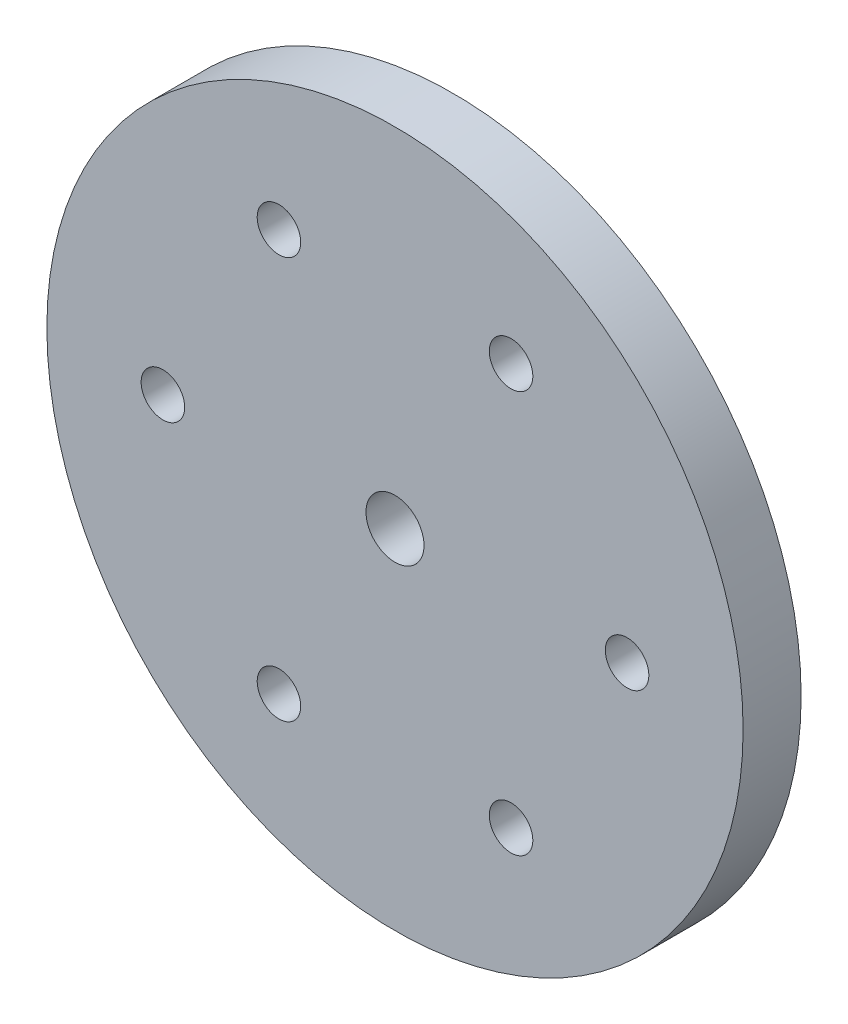
ISO-10303-21;
HEADER;
FILE_DESCRIPTION(('STEP AP214'),'2;1');
FILE_NAME('part.step','',(''),(''),'','','');
FILE_SCHEMA(('AUTOMOTIVE_DESIGN { 1 0 10303 214 1 1 1 1 }'));
ENDSEC;
DATA;
#1=APPLICATION_CONTEXT('core data for automotive mechanical design processes');
#2=APPLICATION_PROTOCOL_DEFINITION('international standard','automotive_design',2000,#1);
#3=PRODUCT_CONTEXT('',#1,'mechanical');
#4=PRODUCT('Part','Part','',(#3));
#5=PRODUCT_RELATED_PRODUCT_CATEGORY('part','',(#4));
#6=PRODUCT_DEFINITION_FORMATION('','',#4);
#7=PRODUCT_DEFINITION_CONTEXT('part definition',#1,'design');
#8=PRODUCT_DEFINITION('design','',#6,#7);
#9=PRODUCT_DEFINITION_SHAPE('','',#8);
#10=(LENGTH_UNIT() NAMED_UNIT(*) SI_UNIT(.MILLI.,.METRE.));
#11=(NAMED_UNIT(*) PLANE_ANGLE_UNIT() SI_UNIT($,.RADIAN.));
#12=(NAMED_UNIT(*) SI_UNIT($,.STERADIAN.) SOLID_ANGLE_UNIT());
#13=UNCERTAINTY_MEASURE_WITH_UNIT(LENGTH_MEASURE(1.E-05),#10,'distance_accuracy_value','');
#14=(GEOMETRIC_REPRESENTATION_CONTEXT(3) GLOBAL_UNCERTAINTY_ASSIGNED_CONTEXT((#13)) GLOBAL_UNIT_ASSIGNED_CONTEXT((#10,
#11,#12)) REPRESENTATION_CONTEXT('',''));
#15=CARTESIAN_POINT('',(0.,0.,0.));
#16=DIRECTION('',(0.,0.,1.));
#17=DIRECTION('',(1.,0.,0.));
#18=AXIS2_PLACEMENT_3D('',#15,#16,#17);
#19=CARTESIAN_POINT('',(0.,0.,6.35));
#20=DIRECTION('',(0.,0.,-1.));
#21=DIRECTION('',(-1.,0.,0.));
#22=AXIS2_PLACEMENT_3D('',#19,#20,#21);
#23=CYLINDRICAL_SURFACE('',#22,38.1);
#24=CARTESIAN_POINT('',(0.,0.,6.35));
#25=DIRECTION('',(0.,0.,1.));
#26=DIRECTION('',(1.,0.,0.));
#27=AXIS2_PLACEMENT_3D('',#24,#25,#26);
#28=CIRCLE('',#27,38.1);
#29=CARTESIAN_POINT('',(38.1,0.,6.35));
#30=VERTEX_POINT('',#29);
#31=EDGE_CURVE('E10',#30,#30,#28,.T.);
#32=ORIENTED_EDGE('',*,*,#31,.F.);
#33=EDGE_LOOP('',(#32));
#34=FACE_BOUND('',#33,.T.);
#35=CARTESIAN_POINT('',(0.,0.,0.));
#36=DIRECTION('',(0.,0.,1.));
#37=DIRECTION('',(1.,0.,0.));
#38=AXIS2_PLACEMENT_3D('',#35,#36,#37);
#39=CIRCLE('',#38,38.1);
#40=CARTESIAN_POINT('',(38.1,0.,0.));
#41=VERTEX_POINT('',#40);
#42=EDGE_CURVE('E46',#41,#41,#39,.T.);
#43=ORIENTED_EDGE('',*,*,#42,.T.);
#44=EDGE_LOOP('',(#43));
#45=FACE_BOUND('',#44,.T.);
#46=ADVANCED_FACE('F43',(#34,#45),#23,.T.);
#47=CARTESIAN_POINT('',(0.,0.,6.35));
#48=DIRECTION('',(0.,0.,1.));
#49=DIRECTION('',(1.,0.,0.));
#50=AXIS2_PLACEMENT_3D('',#47,#48,#49);
#51=PLANE('',#50);
#52=CARTESIAN_POINT('',(0.,0.,6.35));
#53=DIRECTION('',(0.,0.,1.));
#54=DIRECTION('',(1.,0.,0.));
#55=AXIS2_PLACEMENT_3D('',#52,#53,#54);
#56=CIRCLE('',#55,3.175);
#57=CARTESIAN_POINT('',(3.175,0.,6.35));
#58=VERTEX_POINT('',#57);
#59=EDGE_CURVE('E105',#58,#58,#56,.T.);
#60=ORIENTED_EDGE('',*,*,#59,.F.);
#61=EDGE_LOOP('',(#60));
#62=FACE_BOUND('',#61,.T.);
#63=CARTESIAN_POINT('',(25.4,0.,6.35));
#64=DIRECTION('',(0.,0.,-1.));
#65=DIRECTION('',(-1.,0.,0.));
#66=AXIS2_PLACEMENT_3D('',#63,#64,#65);
#67=CIRCLE('',#66,2.38125);
#68=CARTESIAN_POINT('',(23.01875,0.,6.35));
#69=VERTEX_POINT('',#68);
#70=EDGE_CURVE('E55',#69,#69,#67,.T.);
#71=ORIENTED_EDGE('',*,*,#70,.T.);
#72=EDGE_LOOP('',(#71));
#73=FACE_BOUND('',#72,.T.);
#74=CARTESIAN_POINT('',(12.7000000000003,-21.9970452561246,6.35));
#75=DIRECTION('',(0.,0.,-1.));
#76=DIRECTION('',(-1.,0.,0.));
#77=AXIS2_PLACEMENT_3D('',#74,#75,#76);
#78=CIRCLE('',#77,2.38125);
#79=CARTESIAN_POINT('',(10.3187500000003,-21.9970452561246,6.35));
#80=VERTEX_POINT('',#79);
#81=EDGE_CURVE('E91',#80,#80,#78,.T.);
#82=ORIENTED_EDGE('',*,*,#81,.T.);
#83=EDGE_LOOP('',(#82));
#84=FACE_BOUND('',#83,.T.);
#85=CARTESIAN_POINT('',(-12.6999999999998,-21.9970452561249,6.35));
#86=DIRECTION('',(0.,0.,-1.));
#87=DIRECTION('',(-1.,0.,0.));
#88=AXIS2_PLACEMENT_3D('',#85,#86,#87);
#89=CIRCLE('',#88,2.38125);
#90=CARTESIAN_POINT('',(-15.0812499999998,-21.9970452561249,6.35));
#91=VERTEX_POINT('',#90);
#92=EDGE_CURVE('E57',#91,#91,#89,.T.);
#93=ORIENTED_EDGE('',*,*,#92,.T.);
#94=EDGE_LOOP('',(#93));
#95=FACE_BOUND('',#94,.T.);
#96=CARTESIAN_POINT('',(-25.4,-1.77367252013231E-13,6.35));
#97=DIRECTION('',(0.,0.,-1.));
#98=DIRECTION('',(-1.,0.,0.));
#99=AXIS2_PLACEMENT_3D('',#96,#97,#98);
#100=CIRCLE('',#99,2.38125);
#101=CARTESIAN_POINT('',(-27.78125,-1.77367252013231E-13,6.35));
#102=VERTEX_POINT('',#101);
#103=EDGE_CURVE('E66',#102,#102,#100,.T.);
#104=ORIENTED_EDGE('',*,*,#103,.T.);
#105=EDGE_LOOP('',(#104));
#106=FACE_BOUND('',#105,.T.);
#107=CARTESIAN_POINT('',(-12.7000000000001,21.9970452561247,6.35));
#108=DIRECTION('',(0.,0.,-1.));
#109=DIRECTION('',(-1.,0.,0.));
#110=AXIS2_PLACEMENT_3D('',#107,#108,#109);
#111=CIRCLE('',#110,2.38125);
#112=CARTESIAN_POINT('',(-15.0812500000001,21.9970452561247,6.35));
#113=VERTEX_POINT('',#112);
#114=EDGE_CURVE('E74',#113,#113,#111,.T.);
#115=ORIENTED_EDGE('',*,*,#114,.T.);
#116=EDGE_LOOP('',(#115));
#117=FACE_BOUND('',#116,.T.);
#118=CARTESIAN_POINT('',(12.6999999999999,21.9970452561248,6.35));
#119=DIRECTION('',(0.,0.,-1.));
#120=DIRECTION('',(-1.,0.,0.));
#121=AXIS2_PLACEMENT_3D('',#118,#119,#120);
#122=CIRCLE('',#121,2.38125);
#123=CARTESIAN_POINT('',(10.3187499999999,21.9970452561248,6.35));
#124=VERTEX_POINT('',#123);
#125=EDGE_CURVE('E82',#124,#124,#122,.T.);
#126=ORIENTED_EDGE('',*,*,#125,.T.);
#127=EDGE_LOOP('',(#126));
#128=FACE_BOUND('',#127,.T.);
#129=ORIENTED_EDGE('',*,*,#31,.T.);
#130=EDGE_LOOP('',(#129));
#131=FACE_BOUND('',#130,.T.);
#132=ADVANCED_FACE('F123',(#62,#73,#84,#95,#106,#117,#128,#131),#51,.T.);
#133=CARTESIAN_POINT('',(0.,0.,0.));
#134=DIRECTION('',(0.,0.,1.));
#135=DIRECTION('',(1.,0.,0.));
#136=AXIS2_PLACEMENT_3D('',#133,#134,#135);
#137=PLANE('',#136);
#138=CARTESIAN_POINT('',(0.,0.,0.));
#139=DIRECTION('',(0.,0.,1.));
#140=DIRECTION('',(1.,0.,0.));
#141=AXIS2_PLACEMENT_3D('',#138,#139,#140);
#142=CIRCLE('',#141,3.175);
#143=CARTESIAN_POINT('',(3.175,0.,0.));
#144=VERTEX_POINT('',#143);
#145=EDGE_CURVE('E95',#144,#144,#142,.T.);
#146=ORIENTED_EDGE('',*,*,#145,.T.);
#147=EDGE_LOOP('',(#146));
#148=FACE_BOUND('',#147,.T.);
#149=CARTESIAN_POINT('',(25.4,0.,0.));
#150=DIRECTION('',(0.,0.,-1.));
#151=DIRECTION('',(-1.,0.,0.));
#152=AXIS2_PLACEMENT_3D('',#149,#150,#151);
#153=CIRCLE('',#152,2.38125);
#154=CARTESIAN_POINT('',(23.01875,0.,0.));
#155=VERTEX_POINT('',#154);
#156=EDGE_CURVE('E90',#155,#155,#153,.T.);
#157=ORIENTED_EDGE('',*,*,#156,.F.);
#158=EDGE_LOOP('',(#157));
#159=FACE_BOUND('',#158,.T.);
#160=CARTESIAN_POINT('',(12.7000000000003,-21.9970452561246,0.));
#161=DIRECTION('',(0.,0.,-1.));
#162=DIRECTION('',(-1.,0.,0.));
#163=AXIS2_PLACEMENT_3D('',#160,#161,#162);
#164=CIRCLE('',#163,2.38125);
#165=CARTESIAN_POINT('',(10.3187500000003,-21.9970452561246,0.));
#166=VERTEX_POINT('',#165);
#167=EDGE_CURVE('E62',#166,#166,#164,.T.);
#168=ORIENTED_EDGE('',*,*,#167,.F.);
#169=EDGE_LOOP('',(#168));
#170=FACE_BOUND('',#169,.T.);
#171=CARTESIAN_POINT('',(-12.6999999999998,-21.9970452561249,0.));
#172=DIRECTION('',(0.,0.,-1.));
#173=DIRECTION('',(-1.,0.,0.));
#174=AXIS2_PLACEMENT_3D('',#171,#172,#173);
#175=CIRCLE('',#174,2.38125);
#176=CARTESIAN_POINT('',(-15.0812499999998,-21.9970452561249,0.));
#177=VERTEX_POINT('',#176);
#178=EDGE_CURVE('E61',#177,#177,#175,.T.);
#179=ORIENTED_EDGE('',*,*,#178,.F.);
#180=EDGE_LOOP('',(#179));
#181=FACE_BOUND('',#180,.T.);
#182=CARTESIAN_POINT('',(-25.4,-1.77367252013231E-13,0.));
#183=DIRECTION('',(0.,0.,-1.));
#184=DIRECTION('',(-1.,0.,0.));
#185=AXIS2_PLACEMENT_3D('',#182,#183,#184);
#186=CIRCLE('',#185,2.38125);
#187=CARTESIAN_POINT('',(-27.78125,-1.77367252013231E-13,0.));
#188=VERTEX_POINT('',#187);
#189=EDGE_CURVE('E70',#188,#188,#186,.T.);
#190=ORIENTED_EDGE('',*,*,#189,.F.);
#191=EDGE_LOOP('',(#190));
#192=FACE_BOUND('',#191,.T.);
#193=CARTESIAN_POINT('',(-12.7000000000001,21.9970452561247,0.));
#194=DIRECTION('',(0.,0.,-1.));
#195=DIRECTION('',(-1.,0.,0.));
#196=AXIS2_PLACEMENT_3D('',#193,#194,#195);
#197=CIRCLE('',#196,2.38125);
#198=CARTESIAN_POINT('',(-15.0812500000001,21.9970452561247,0.));
#199=VERTEX_POINT('',#198);
#200=EDGE_CURVE('E78',#199,#199,#197,.T.);
#201=ORIENTED_EDGE('',*,*,#200,.F.);
#202=EDGE_LOOP('',(#201));
#203=FACE_BOUND('',#202,.T.);
#204=CARTESIAN_POINT('',(12.6999999999999,21.9970452561248,0.));
#205=DIRECTION('',(0.,0.,-1.));
#206=DIRECTION('',(-1.,0.,0.));
#207=AXIS2_PLACEMENT_3D('',#204,#205,#206);
#208=CIRCLE('',#207,2.38125);
#209=CARTESIAN_POINT('',(10.3187499999999,21.9970452561248,0.));
#210=VERTEX_POINT('',#209);
#211=EDGE_CURVE('E86',#210,#210,#208,.T.);
#212=ORIENTED_EDGE('',*,*,#211,.F.);
#213=EDGE_LOOP('',(#212));
#214=FACE_BOUND('',#213,.T.);
#215=ORIENTED_EDGE('',*,*,#42,.F.);
#216=EDGE_LOOP('',(#215));
#217=FACE_BOUND('',#216,.T.);
#218=ADVANCED_FACE('F113',(#148,#159,#170,#181,#192,#203,#214,#217),#137,.F.);
#219=CARTESIAN_POINT('',(12.6999999999999,21.9970452561248,6.35));
#220=DIRECTION('',(0.,0.,-1.));
#221=DIRECTION('',(-1.,0.,0.));
#222=AXIS2_PLACEMENT_3D('',#219,#220,#221);
#223=CYLINDRICAL_SURFACE('',#222,2.38125);
#224=ORIENTED_EDGE('',*,*,#125,.F.);
#225=EDGE_LOOP('',(#224));
#226=FACE_BOUND('',#225,.T.);
#227=ORIENTED_EDGE('',*,*,#211,.T.);
#228=EDGE_LOOP('',(#227));
#229=FACE_BOUND('',#228,.T.);
#230=ADVANCED_FACE('F139',(#226,#229),#223,.F.);
#231=CARTESIAN_POINT('',(-12.7000000000001,21.9970452561247,6.35));
#232=DIRECTION('',(0.,0.,-1.));
#233=DIRECTION('',(-1.,0.,0.));
#234=AXIS2_PLACEMENT_3D('',#231,#232,#233);
#235=CYLINDRICAL_SURFACE('',#234,2.38125);
#236=ORIENTED_EDGE('',*,*,#114,.F.);
#237=EDGE_LOOP('',(#236));
#238=FACE_BOUND('',#237,.T.);
#239=ORIENTED_EDGE('',*,*,#200,.T.);
#240=EDGE_LOOP('',(#239));
#241=FACE_BOUND('',#240,.T.);
#242=ADVANCED_FACE('F142',(#238,#241),#235,.F.);
#243=CARTESIAN_POINT('',(-25.4,-1.77367252013231E-13,6.35));
#244=DIRECTION('',(0.,0.,-1.));
#245=DIRECTION('',(-1.,0.,0.));
#246=AXIS2_PLACEMENT_3D('',#243,#244,#245);
#247=CYLINDRICAL_SURFACE('',#246,2.38125);
#248=ORIENTED_EDGE('',*,*,#103,.F.);
#249=EDGE_LOOP('',(#248));
#250=FACE_BOUND('',#249,.T.);
#251=ORIENTED_EDGE('',*,*,#189,.T.);
#252=EDGE_LOOP('',(#251));
#253=FACE_BOUND('',#252,.T.);
#254=ADVANCED_FACE('F168',(#250,#253),#247,.F.);
#255=CARTESIAN_POINT('',(-12.6999999999998,-21.9970452561249,6.35));
#256=DIRECTION('',(0.,0.,-1.));
#257=DIRECTION('',(-1.,0.,0.));
#258=AXIS2_PLACEMENT_3D('',#255,#256,#257);
#259=CYLINDRICAL_SURFACE('',#258,2.38125);
#260=ORIENTED_EDGE('',*,*,#92,.F.);
#261=EDGE_LOOP('',(#260));
#262=FACE_BOUND('',#261,.T.);
#263=ORIENTED_EDGE('',*,*,#178,.T.);
#264=EDGE_LOOP('',(#263));
#265=FACE_BOUND('',#264,.T.);
#266=ADVANCED_FACE('F177',(#262,#265),#259,.F.);
#267=CARTESIAN_POINT('',(12.7000000000003,-21.9970452561246,6.35));
#268=DIRECTION('',(0.,0.,-1.));
#269=DIRECTION('',(-1.,0.,0.));
#270=AXIS2_PLACEMENT_3D('',#267,#268,#269);
#271=CYLINDRICAL_SURFACE('',#270,2.38125);
#272=ORIENTED_EDGE('',*,*,#81,.F.);
#273=EDGE_LOOP('',(#272));
#274=FACE_BOUND('',#273,.T.);
#275=ORIENTED_EDGE('',*,*,#167,.T.);
#276=EDGE_LOOP('',(#275));
#277=FACE_BOUND('',#276,.T.);
#278=ADVANCED_FACE('F186',(#274,#277),#271,.F.);
#279=CARTESIAN_POINT('',(25.4,0.,6.35));
#280=DIRECTION('',(0.,0.,-1.));
#281=DIRECTION('',(-1.,0.,0.));
#282=AXIS2_PLACEMENT_3D('',#279,#280,#281);
#283=CYLINDRICAL_SURFACE('',#282,2.38125);
#284=ORIENTED_EDGE('',*,*,#70,.F.);
#285=EDGE_LOOP('',(#284));
#286=FACE_BOUND('',#285,.T.);
#287=ORIENTED_EDGE('',*,*,#156,.T.);
#288=EDGE_LOOP('',(#287));
#289=FACE_BOUND('',#288,.T.);
#290=ADVANCED_FACE('F119',(#286,#289),#283,.F.);
#291=CARTESIAN_POINT('',(0.,0.,0.));
#292=DIRECTION('',(0.,0.,1.));
#293=DIRECTION('',(1.,0.,0.));
#294=AXIS2_PLACEMENT_3D('',#291,#292,#293);
#295=CYLINDRICAL_SURFACE('',#294,3.175);
#296=ORIENTED_EDGE('',*,*,#145,.F.);
#297=EDGE_LOOP('',(#296));
#298=FACE_BOUND('',#297,.T.);
#299=ORIENTED_EDGE('',*,*,#59,.T.);
#300=EDGE_LOOP('',(#299));
#301=FACE_BOUND('',#300,.T.);
#302=ADVANCED_FACE('F116',(#298,#301),#295,.F.);
#303=CLOSED_SHELL('',(#46,#132,#218,#230,#242,#254,#266,#278,#290,#302));
#304=MANIFOLD_SOLID_BREP('B2',#303);
#305=ADVANCED_BREP_SHAPE_REPRESENTATION('',(#18,#304),#14);
#306=SHAPE_DEFINITION_REPRESENTATION(#9,#305);
ENDSEC;
END-ISO-10303-21;
